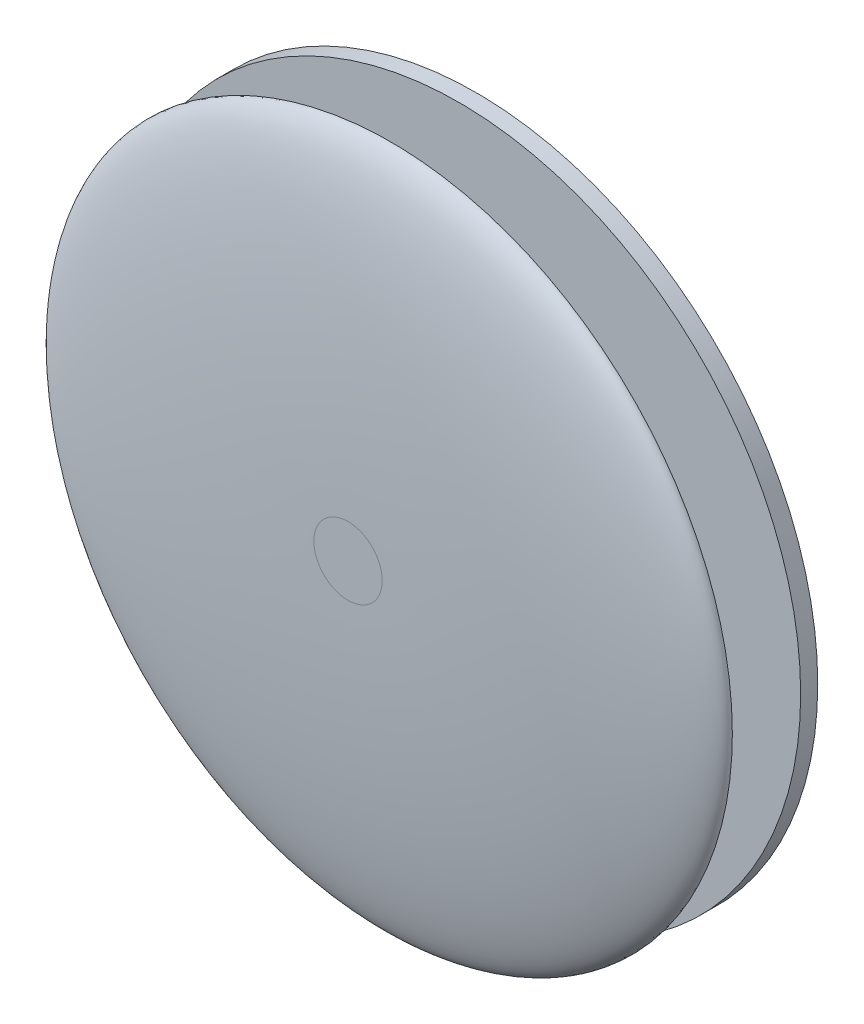
ISO-10303-21;
HEADER;
FILE_DESCRIPTION(('STEP AP214'),'2;1');
FILE_NAME('part.step','',(''),(''),'','','');
FILE_SCHEMA(('AUTOMOTIVE_DESIGN { 1 0 10303 214 1 1 1 1 }'));
ENDSEC;
DATA;
#1=APPLICATION_CONTEXT('core data for automotive mechanical design processes');
#2=APPLICATION_PROTOCOL_DEFINITION('international standard','automotive_design',2000,#1);
#3=PRODUCT_CONTEXT('',#1,'mechanical');
#4=PRODUCT('Part','Part','',(#3));
#5=PRODUCT_RELATED_PRODUCT_CATEGORY('part','',(#4));
#6=PRODUCT_DEFINITION_FORMATION('','',#4);
#7=PRODUCT_DEFINITION_CONTEXT('part definition',#1,'design');
#8=PRODUCT_DEFINITION('design','',#6,#7);
#9=PRODUCT_DEFINITION_SHAPE('','',#8);
#10=(LENGTH_UNIT() NAMED_UNIT(*) SI_UNIT(.MILLI.,.METRE.));
#11=(NAMED_UNIT(*) PLANE_ANGLE_UNIT() SI_UNIT($,.RADIAN.));
#12=(NAMED_UNIT(*) SI_UNIT($,.STERADIAN.) SOLID_ANGLE_UNIT());
#13=UNCERTAINTY_MEASURE_WITH_UNIT(LENGTH_MEASURE(1.E-05),#10,'distance_accuracy_value','');
#14=(GEOMETRIC_REPRESENTATION_CONTEXT(3) GLOBAL_UNCERTAINTY_ASSIGNED_CONTEXT((#13)) GLOBAL_UNIT_ASSIGNED_CONTEXT((#10,
#11,#12)) REPRESENTATION_CONTEXT('',''));
#15=CARTESIAN_POINT('',(0.,0.,0.));
#16=DIRECTION('',(0.,0.,1.));
#17=DIRECTION('',(1.,0.,0.));
#18=AXIS2_PLACEMENT_3D('',#15,#16,#17);
#19=CARTESIAN_POINT('',(0.,0.,4.));
#20=DIRECTION('',(0.,0.,-1.));
#21=DIRECTION('',(-1.,0.,0.));
#22=AXIS2_PLACEMENT_3D('',#19,#20,#21);
#23=CYLINDRICAL_SURFACE('',#22,15.);
#24=CARTESIAN_POINT('',(0.,0.,4.));
#25=DIRECTION('',(0.,0.,1.));
#26=DIRECTION('',(1.,0.,0.));
#27=AXIS2_PLACEMENT_3D('',#24,#25,#26);
#28=CIRCLE('',#27,15.);
#29=CARTESIAN_POINT('',(15.,0.,4.));
#30=VERTEX_POINT('',#29);
#31=EDGE_CURVE('E161',#30,#30,#28,.T.);
#32=ORIENTED_EDGE('',*,*,#31,.F.);
#33=EDGE_LOOP('',(#32));
#34=FACE_BOUND('',#33,.T.);
#35=CARTESIAN_POINT('',(0.,0.,-4.));
#36=DIRECTION('',(0.,0.,1.));
#37=DIRECTION('',(1.,0.,0.));
#38=AXIS2_PLACEMENT_3D('',#35,#36,#37);
#39=CIRCLE('',#38,15.);
#40=CARTESIAN_POINT('',(15.,0.,-4.));
#41=VERTEX_POINT('',#40);
#42=EDGE_CURVE('E155',#41,#41,#39,.T.);
#43=ORIENTED_EDGE('',*,*,#42,.T.);
#44=EDGE_LOOP('',(#43));
#45=FACE_BOUND('',#44,.T.);
#46=CARTESIAN_POINT('',(15.,0.,1.));
#47=CARTESIAN_POINT('',(14.9999995579846,-0.0561035908041249,0.999997534451765));
#48=CARTESIAN_POINT('',(14.9996818744052,-0.112246272047745,0.995262712370675));
#49=CARTESIAN_POINT('',(14.99844511371,-0.222980853460928,0.976442840265436));
#50=CARTESIAN_POINT('',(14.9975253399424,-0.27757088068208,0.962346958699722));
#51=CARTESIAN_POINT('',(14.9951884301052,-0.383580167359696,0.925212124878914));
#52=CARTESIAN_POINT('',(14.9937715598241,-0.435001104032173,0.902177951070831));
#53=CARTESIAN_POINT('',(14.9905997328555,-0.53323346528299,0.84782828282879));
#54=CARTESIAN_POINT('',(14.9888448527116,-0.580045929848533,0.816514662711579));
#55=CARTESIAN_POINT('',(14.9851908975273,-0.667824599458843,0.746437399417309));
#56=CARTESIAN_POINT('',(14.9832916119278,-0.708782006678586,0.707662746156459));
#57=CARTESIAN_POINT('',(14.9795646978327,-0.783612634377517,0.623786928205346));
#58=CARTESIAN_POINT('',(14.9777370723604,-0.817485556226103,0.578685496957766));
#59=CARTESIAN_POINT('',(14.9743579336721,-0.877213460326697,0.483385708670559));
#60=CARTESIAN_POINT('',(14.9728066763058,-0.903061029326378,0.433182695620674));
#61=CARTESIAN_POINT('',(14.970157972686,-0.945957097391599,0.329137425503219));
#62=CARTESIAN_POINT('',(14.9690605209997,-0.963005701794719,0.275295212011386));
#63=CARTESIAN_POINT('',(14.9674452176353,-0.987795199392888,0.165585555390212));
#64=CARTESIAN_POINT('',(14.9669264989871,-0.995550016427559,0.109721271399651));
#65=CARTESIAN_POINT('',(14.9665245630443,-1.00157479750803,-0.00251829772613971));
#66=CARTESIAN_POINT('',(14.9666413377159,-0.999844881457584,-0.0588935763925017));
#67=CARTESIAN_POINT('',(14.9674964150486,-0.986960846772746,-0.170459876015289));
#68=CARTESIAN_POINT('',(14.9682337232656,-0.975821806744588,-0.225652646979321));
#69=CARTESIAN_POINT('',(14.9702452157825,-0.944459115591351,-0.333383290428474));
#70=CARTESIAN_POINT('',(14.9715194036602,-0.924235403922088,-0.38592114521749));
#71=CARTESIAN_POINT('',(14.9744622124897,-0.875260370110762,-0.486898974460401));
#72=CARTESIAN_POINT('',(14.9761311489876,-0.84650222117438,-0.535335628297438));
#73=CARTESIAN_POINT('',(14.9796750723207,-0.78127959292322,-0.626699812511218));
#74=CARTESIAN_POINT('',(14.9815500618019,-0.744815014647449,-0.669627272131067));
#75=CARTESIAN_POINT('',(14.985299217381,-0.665129760832788,-0.748842234727569));
#76=CARTESIAN_POINT('',(14.9871733747298,-0.621896038198311,-0.785116614861973));
#77=CARTESIAN_POINT('',(14.990706156798,-0.529945441656851,-0.849894457053169));
#78=CARTESIAN_POINT('',(14.9923647814319,-0.481228565576779,-0.878397916030164));
#79=CARTESIAN_POINT('',(14.9952797619227,-0.379686494733829,-0.926823748734274));
#80=CARTESIAN_POINT('',(14.9965360937791,-0.326861055090797,-0.946745610514378));
#81=CARTESIAN_POINT('',(14.9985046094346,-0.2186049960803,-0.977433899568392));
#82=CARTESIAN_POINT('',(14.9992168004624,-0.163174411331704,-0.988200448467794));
#83=CARTESIAN_POINT('',(15.0000158534359,-0.0513953711246011,-1.00025619425658));
#84=CARTESIAN_POINT('',(15.0001039123065,0.00495111964684439,-1.00156353158073));
#85=CARTESIAN_POINT('',(14.9996479643198,0.1170625716756,-0.994711163728064));
#86=CARTESIAN_POINT('',(14.9991039612117,0.17282753638049,-0.986551514708553));
#87=CARTESIAN_POINT('',(14.9974458893639,0.282141760529371,-0.961011819645208));
#88=CARTESIAN_POINT('',(14.9963323361678,0.335692976508958,-0.943640111622392));
#89=CARTESIAN_POINT('',(14.9936604087425,0.439120008014194,-0.90017789431421));
#90=CARTESIAN_POINT('',(14.9921020299676,0.488995785972854,-0.874087295927348));
#91=CARTESIAN_POINT('',(14.9887124988692,0.583739131383284,-0.813881840139116));
#92=CARTESIAN_POINT('',(14.9868809368237,0.628598996013498,-0.779754884473148));
#93=CARTESIAN_POINT('',(14.9831524773505,0.711959527646486,-0.704463039096035));
#94=CARTESIAN_POINT('',(14.9812555791934,0.75046012362045,-0.66329807078541));
#95=CARTESIAN_POINT('',(14.9776067587531,0.820070815484494,-0.575020376539933));
#96=CARTESIAN_POINT('',(14.9758550704263,0.851169130356618,-0.527898349782742));
#97=CARTESIAN_POINT('',(14.9726979544392,0.905011874107379,-0.429090824430136));
#98=CARTESIAN_POINT('',(14.971292524406,0.927756360237217,-0.377405357112309));
#99=CARTESIAN_POINT('',(14.9689881146233,0.964225471727894,-0.270980908700749));
#100=CARTESIAN_POINT('',(14.9680887206512,0.977957475914838,-0.216244465484761));
#101=CARTESIAN_POINT('',(14.9668966664299,0.996035908200023,-0.105236668445006));
#102=CARTESIAN_POINT('',(14.9666039991678,1.0003824447804,-0.0489653323699452));
#103=CARTESIAN_POINT('',(14.9666585741728,0.999565483534788,0.0633977896361487));
#104=CARTESIAN_POINT('',(14.9670045703421,0.994420504639091,0.119489711756449));
#105=CARTESIAN_POINT('',(14.9682948425397,0.974804994261808,0.230011267467633));
#106=CARTESIAN_POINT('',(14.9692391196265,0.960334446280208,0.284440898117195));
#107=CARTESIAN_POINT('',(14.9716192360536,0.92248283778284,0.390095294263964));
#108=CARTESIAN_POINT('',(14.9730550683655,0.899101904669178,0.441320105571997));
#109=CARTESIAN_POINT('',(14.9762564813155,0.844095647375272,0.539119741918501));
#110=CARTESIAN_POINT('',(14.9780220540122,0.812470521740288,0.585694678902752));
#111=CARTESIAN_POINT('',(14.9816880295888,0.74180477494363,0.672966638999559));
#112=CARTESIAN_POINT('',(14.9835886735546,0.702750674582999,0.713652737331899));
#113=CARTESIAN_POINT('',(14.9873085213532,0.618355426554709,0.787906009267211));
#114=CARTESIAN_POINT('',(14.9891277051874,0.573012746113305,0.821471442223763));
#115=CARTESIAN_POINT('',(14.9924817745562,0.477269598838893,0.880558817545837));
#116=CARTESIAN_POINT('',(14.994016274223,0.426862407970513,0.906069875193851));
#117=CARTESIAN_POINT('',(14.9966230436255,0.322506215419355,0.948235029231639));
#118=CARTESIAN_POINT('',(14.9976958526619,0.268561431383448,0.964899464703577));
#119=CARTESIAN_POINT('',(14.9989782377769,0.178573873772114,0.984582489588203));
#120=CARTESIAN_POINT('',(14.9993596884566,0.143112284161978,0.990356543317503));
#121=CARTESIAN_POINT('',(14.9998707107647,0.0717724628196567,0.998066084172604));
#122=CARTESIAN_POINT('',(15.0000002827948,0.0358942317520725,1.0000015774206));
#123=CARTESIAN_POINT('',(15.,0.,1.));
#124=B_SPLINE_CURVE_WITH_KNOTS('',3,(#46,#47,#48,#49,#50,#51,#52,#53,#54,#55,#56,#57,#58,#59,
#60,#61,#62,#63,#64,#65,#66,#67,#68,#69,#70,#71,#72,#73,#74,#75,#76,#77,#78,#79,#80,#81,#82,#83,
#84,#85,#86,#87,#88,#89,#90,#91,#92,#93,#94,#95,#96,#97,#98,#99,#100,#101,#102,#103,#104,#105,
#106,#107,#108,#109,#110,#111,#112,#113,#114,#115,#116,#117,#118,#119,#120,#121,#122,#123),
.UNSPECIFIED.,.T.,.F.,(4,2,2,2,2,2,2,2,2,2,2,2,2,2,2,2,2,2,2,2,2,2,2,2,2,2,2,2,2,2,2,2,2,2,2,2,
2,2,4),(0.,0.168179734044292,0.336554406184462,0.504839188283248,0.673085906323963,
0.841582833287236,1.01008686142994,1.17874608173166,1.34740328286781,1.51580748668391,
1.68420956157893,1.85234227434813,2.02047610764315,2.18874479730908,2.35701564790423,
2.52561491574574,2.69421425040695,2.86282364170141,3.03143079303741,3.19971451152963,
3.36799723178317,3.53612789526984,3.70426027699717,3.87264740882399,4.04103642129616,
4.20969166582445,4.37834575448806,4.54686158747343,4.71537547265433,4.88356091745659,
5.05174665983533,5.21992999755776,5.3881092852874,5.55659668097782,5.72512521606818,
5.89388053603615,6.06243819437153,6.17003722486686,6.27763608375031),.UNSPECIFIED.);
#125=CARTESIAN_POINT('',(15.,0.,1.));
#126=VERTEX_POINT('',#125);
#127=EDGE_CURVE('E128',#126,#126,#124,.T.);
#128=ORIENTED_EDGE('',*,*,#127,.F.);
#129=EDGE_LOOP('',(#128));
#130=FACE_BOUND('',#129,.T.);
#131=ADVANCED_FACE('F49',(#34,#45,#130),#23,.T.);
#132=CARTESIAN_POINT('',(0.,0.,4.));
#133=DIRECTION('',(0.,0.,-1.));
#134=DIRECTION('',(-1.,0.,0.));
#135=AXIS2_PLACEMENT_3D('',#132,#133,#134);
#136=CYLINDRICAL_SURFACE('',#135,2.5);
#137=CARTESIAN_POINT('',(0.,0.,-6.));
#138=DIRECTION('',(0.,0.,1.));
#139=DIRECTION('',(1.,0.,0.));
#140=AXIS2_PLACEMENT_3D('',#137,#138,#139);
#141=CIRCLE('',#140,2.5);
#142=CARTESIAN_POINT('',(2.5,0.,-6.));
#143=VERTEX_POINT('',#142);
#144=EDGE_CURVE('E156',#143,#143,#141,.T.);
#145=ORIENTED_EDGE('',*,*,#144,.F.);
#146=EDGE_LOOP('',(#145));
#147=FACE_BOUND('',#146,.T.);
#148=CARTESIAN_POINT('',(0.,0.,4.));
#149=DIRECTION('',(0.,0.,1.));
#150=DIRECTION('',(1.,0.,0.));
#151=AXIS2_PLACEMENT_3D('',#148,#149,#150);
#152=CIRCLE('',#151,2.5);
#153=CARTESIAN_POINT('',(2.5,0.,4.));
#154=VERTEX_POINT('',#153);
#155=EDGE_CURVE('E152',#154,#154,#152,.T.);
#156=ORIENTED_EDGE('',*,*,#155,.T.);
#157=EDGE_LOOP('',(#156));
#158=FACE_BOUND('',#157,.T.);
#159=CARTESIAN_POINT('',(2.5,0.,1.));
#160=CARTESIAN_POINT('',(2.49999635613542,-0.0537465027214456,0.999995074088137));
#161=CARTESIAN_POINT('',(2.49824647153466,-0.107586282045337,0.995641123955812));
#162=CARTESIAN_POINT('',(2.49141726550321,-0.213748240208948,0.978376148239382));
#163=CARTESIAN_POINT('',(2.48632889349439,-0.266065888780624,0.965441860456933));
#164=CARTESIAN_POINT('',(2.47337104606559,-0.367476961363701,0.931561960970584));
#165=CARTESIAN_POINT('',(2.46551068182036,-0.416580330808479,0.910642576891635));
#166=CARTESIAN_POINT('',(2.44778305398039,-0.510535985164184,0.861490413336727));
#167=CARTESIAN_POINT('',(2.43791648729028,-0.555389738375496,0.833260172540535));
#168=CARTESIAN_POINT('',(2.41665443085209,-0.641750503785197,0.768882250719531));
#169=CARTESIAN_POINT('',(2.40521148464595,-0.683031136275106,0.732446671879868));
#170=CARTESIAN_POINT('',(2.38230288453097,-0.759087502392361,0.653299998261611));
#171=CARTESIAN_POINT('',(2.37083722226896,-0.793860053566766,0.610585851394129));
#172=CARTESIAN_POINT('',(2.34861395898568,-0.857437283646439,0.517785964878866));
#173=CARTESIAN_POINT('',(2.33791057982476,-0.885907490597736,0.467456756988401));
#174=CARTESIAN_POINT('',(2.31916823593396,-0.933877359518574,0.362231800789979));
#175=CARTESIAN_POINT('',(2.31112800622088,-0.953381282142917,0.30733823607582));
#176=CARTESIAN_POINT('',(2.29913178830409,-0.981949411697934,0.197143833203949));
#177=CARTESIAN_POINT('',(2.29500710177802,-0.991446982902824,0.141974382211893));
#178=CARTESIAN_POINT('',(2.29082002024572,-1.00108648082001,0.0306825008463662));
#179=CARTESIAN_POINT('',(2.29075562761384,-1.00123300815661,-0.0254394473125075));
#180=CARTESIAN_POINT('',(2.29455250139997,-0.992494683752272,-0.132878335729022));
#181=CARTESIAN_POINT('',(2.29814087519225,-0.984237657152568,-0.184257857204516));
#182=CARTESIAN_POINT('',(2.30838093803918,-0.95997344014891,-0.284829778003357));
#183=CARTESIAN_POINT('',(2.31503316160836,-0.943964897402315,-0.334021794055154));
#184=CARTESIAN_POINT('',(2.33079742544265,-0.904347366275536,-0.430008918098021));
#185=CARTESIAN_POINT('',(2.33995689640394,-0.880589931157658,-0.476734619527345));
#186=CARTESIAN_POINT('',(2.35969058194945,-0.826253230366107,-0.565707908180782));
#187=CARTESIAN_POINT('',(2.37026532728424,-0.795671402550422,-0.607953804701403));
#188=CARTESIAN_POINT('',(2.39263368371135,-0.725775299727216,-0.690204864400999));
#189=CARTESIAN_POINT('',(2.40445832488076,-0.685968731485317,-0.729784364723008));
#190=CARTESIAN_POINT('',(2.42729912479141,-0.600157213715096,-0.80184223900102));
#191=CARTESIAN_POINT('',(2.43831512222662,-0.554151032667216,-0.834319198705147));
#192=CARTESIAN_POINT('',(2.45857340632274,-0.456038826302921,-0.891808723707917));
#193=CARTESIAN_POINT('',(2.46777635047707,-0.403830245673238,-0.916661140598527));
#194=CARTESIAN_POINT('',(2.48307414164379,-0.295511882741441,-0.957083930539028));
#195=CARTESIAN_POINT('',(2.48917056731191,-0.239404098424836,-0.972659018778705));
#196=CARTESIAN_POINT('',(2.49728069753455,-0.12844794380391,-0.993224147709852));
#197=CARTESIAN_POINT('',(2.49951472916757,-0.0737216469927669,-0.99878622712678));
#198=CARTESIAN_POINT('',(2.50034239255315,0.0359226549039089,-1.00085655026431));
#199=CARTESIAN_POINT('',(2.49893696791146,0.0908406066119622,-0.997367140773755));
#200=CARTESIAN_POINT('',(2.49278783531876,0.196716369560994,-0.981854123724004));
#201=CARTESIAN_POINT('',(2.48819695672762,0.247741245887738,-0.970221009824512));
#202=CARTESIAN_POINT('',(2.4762972070275,0.34706771403039,-0.939282145845093));
#203=CARTESIAN_POINT('',(2.46898798678265,0.395368955112423,-0.919975410165659));
#204=CARTESIAN_POINT('',(2.45208297385406,0.489539392908351,-0.873607530160025));
#205=CARTESIAN_POINT('',(2.44242407989902,0.535289011377703,-0.846327263978427));
#206=CARTESIAN_POINT('',(2.42186682372762,0.621721795623278,-0.785029838047178));
#207=CARTESIAN_POINT('',(2.41096796555135,0.662402920380563,-0.751009978538692));
#208=CARTESIAN_POINT('',(2.38822558819056,0.74036152151441,-0.674564993525186));
#209=CARTESIAN_POINT('',(2.37636720712526,0.777236966903033,-0.631733229246896));
#210=CARTESIAN_POINT('',(2.35370836458566,0.843375598706856,-0.540279958495316));
#211=CARTESIAN_POINT('',(2.34290807763255,0.872637530668755,-0.491657499830025));
#212=CARTESIAN_POINT('',(2.32357149953854,0.922903750965814,-0.389269152702947));
#213=CARTESIAN_POINT('',(2.31505815442394,0.943825297267227,-0.335458000393844));
#214=CARTESIAN_POINT('',(2.30161836738966,0.976148109852652,-0.224633174142421));
#215=CARTESIAN_POINT('',(2.29668927847999,0.987556402634658,-0.167621897093786));
#216=CARTESIAN_POINT('',(2.29135879649963,0.999857808639201,-0.0564360491127281));
#217=CARTESIAN_POINT('',(2.29065710504086,1.00144854115143,-0.0023525802033241));
#218=CARTESIAN_POINT('',(2.29307418016549,0.995901579638762,0.105272428856647));
#219=CARTESIAN_POINT('',(2.29619246162397,0.988764993956891,0.158814036951292));
#220=CARTESIAN_POINT('',(2.3056332453951,0.966535683076824,0.261666094927521));
#221=CARTESIAN_POINT('',(2.31182415913725,0.951768746785489,0.3110601372165));
#222=CARTESIAN_POINT('',(2.32662000616348,0.915002724245506,0.406689314806741));
#223=CARTESIAN_POINT('',(2.33522560603003,0.893001640696906,0.452923573449913));
#224=CARTESIAN_POINT('',(2.35449304802246,0.840936381379865,0.543804809635389));
#225=CARTESIAN_POINT('',(2.36524441156621,0.810482667579745,0.588209335065242));
#226=CARTESIAN_POINT('',(2.38731902186119,0.742946059635748,0.671496658601878));
#227=CARTESIAN_POINT('',(2.39864244024203,0.70586116740906,0.710377786064158));
#228=CARTESIAN_POINT('',(2.42146783543697,0.623252753136231,0.784101426631808));
#229=CARTESIAN_POINT('',(2.43293378981093,0.577338000573069,0.818518653449034));
#230=CARTESIAN_POINT('',(2.45400203356858,0.479950160142889,0.879168521310818));
#231=CARTESIAN_POINT('',(2.46360345546453,0.428474502273618,0.905397356076264));
#232=CARTESIAN_POINT('',(2.47969857407931,0.322369031247601,0.948311107595145));
#233=CARTESIAN_POINT('',(2.48624681527514,0.267815809109848,0.965164661780169));
#234=CARTESIAN_POINT('',(2.49572153104683,0.15643827314061,0.989319560477133));
#235=CARTESIAN_POINT('',(2.49865949747819,0.0996217629294559,0.99665121837195));
#236=CARTESIAN_POINT('',(2.49987949752068,0.0284561489454644,0.999697690489137));
#237=CARTESIAN_POINT('',(2.50000096484588,0.014231344370379,1.0000013043146));
#238=CARTESIAN_POINT('',(2.5,0.,1.));
#239=B_SPLINE_CURVE_WITH_KNOTS('',3,(#159,#160,#161,#162,#163,#164,#165,#166,#167,#168,#169,
#170,#171,#172,#173,#174,#175,#176,#177,#178,#179,#180,#181,#182,#183,#184,#185,#186,#187,#188,
#189,#190,#191,#192,#193,#194,#195,#196,#197,#198,#199,#200,#201,#202,#203,#204,#205,#206,#207,
#208,#209,#210,#211,#212,#213,#214,#215,#216,#217,#218,#219,#220,#221,#222,#223,#224,#225,#226,
#227,#228,#229,#230,#231,#232,#233,#234,#235,#236,#237,#238),.UNSPECIFIED.,.T.,.F.,(4,2,2,2,2,2,
2,2,2,2,2,2,2,2,2,2,2,2,2,2,2,2,2,2,2,2,2,2,2,2,2,2,2,2,2,2,2,2,2,4),(0.,0.161201493946536,
0.322841818003967,0.483955728735791,0.645013767839921,0.812986908501986,0.981041974672057,
1.15657629409608,1.33202711559134,1.49952052654414,1.66693153170244,1.82269164200686,
1.97847893628024,2.13744563149408,2.29647210969092,2.46779174593278,2.63914546419866,
2.81388456581403,2.98853478056895,3.15284592264004,3.31711446785041,3.47400227782183,
3.63091024496898,3.79261756699131,3.95438979749484,4.12684237312207,4.29932334521874,
4.47347522570414,4.64749836322967,4.80899836696374,4.97047786281523,5.12557159274385,
5.28070817902581,5.44472734028346,5.60879600674197,5.78350211766918,5.95828931820266,
6.12982150506659,6.30080626202171,6.34349022948398),.UNSPECIFIED.);
#240=CARTESIAN_POINT('',(2.5,0.,1.));
#241=VERTEX_POINT('',#240);
#242=EDGE_CURVE('E57',#241,#241,#239,.T.);
#243=ORIENTED_EDGE('',*,*,#242,.T.);
#244=EDGE_LOOP('',(#243));
#245=FACE_BOUND('',#244,.T.);
#246=ADVANCED_FACE('F99',(#147,#158,#245),#136,.F.);
#247=CARTESIAN_POINT('',(0.,0.,9.));
#248=DIRECTION('',(0.,0.,1.));
#249=DIRECTION('',(1.,0.,0.));
#250=AXIS2_PLACEMENT_3D('',#247,#248,#249);
#251=PLANE('',#250);
#252=CARTESIAN_POINT('',(4.,0.,9.));
#253=CARTESIAN_POINT('',(4.,-0.523598770144721,9.));
#254=CARTESIAN_POINT('',(3.89589070458609,-1.04699154247611,9.));
#255=CARTESIAN_POINT('',(3.49514555550419,-2.01447591644461,9.));
#256=CARTESIAN_POINT('',(3.19866736573605,-2.45818688375644,9.));
#257=CARTESIAN_POINT('',(2.45818688375631,-3.19866736573595,9.));
#258=CARTESIAN_POINT('',(2.01447591644466,-3.49514555550419,9.));
#259=CARTESIAN_POINT('',(1.04699154247604,-3.8958907045861,9.));
#260=CARTESIAN_POINT('',(0.523598770144151,-4.,9.));
#261=CARTESIAN_POINT('',(-0.523598770144139,-4.,9.));
#262=CARTESIAN_POINT('',(-1.04699154247611,-3.89589070458598,9.));
#263=CARTESIAN_POINT('',(-2.01447591644461,-3.4951455555043,9.));
#264=CARTESIAN_POINT('',(-2.45818688375634,-3.19866736573604,9.));
#265=CARTESIAN_POINT('',(-3.19866736573603,-2.45818688375634,9.));
#266=CARTESIAN_POINT('',(-3.49514555550418,-2.01447591644461,9.));
#267=CARTESIAN_POINT('',(-3.89589070458611,-1.04699154247609,9.));
#268=CARTESIAN_POINT('',(-4.,-0.523598770144144,9.));
#269=CARTESIAN_POINT('',(-4.,0.523598770144145,9.));
#270=CARTESIAN_POINT('',(-3.89589070458611,1.04699154247605,9.));
#271=CARTESIAN_POINT('',(-3.49514555550417,2.01447591644468,9.));
#272=CARTESIAN_POINT('',(-3.19866736573592,2.45818688375634,9.));
#273=CARTESIAN_POINT('',(-2.45818688375646,3.19866736573603,9.));
#274=CARTESIAN_POINT('',(-2.01447591644464,3.49514555550424,9.));
#275=CARTESIAN_POINT('',(-1.04699154247607,3.89589070458605,9.));
#276=CARTESIAN_POINT('',(-0.523598770144144,4.,9.));
#277=CARTESIAN_POINT('',(0.523598770144145,4.,9.));
#278=CARTESIAN_POINT('',(1.04699154247613,3.89589070458605,9.));
#279=CARTESIAN_POINT('',(2.01447591644458,3.49514555550424,9.));
#280=CARTESIAN_POINT('',(2.45818688375639,3.1986673657361,9.));
#281=CARTESIAN_POINT('',(3.19866736573599,2.45818688375628,9.));
#282=CARTESIAN_POINT('',(3.49514555550426,2.01447591644457,9.));
#283=CARTESIAN_POINT('',(3.89589070458602,1.04699154247614,9.));
#284=CARTESIAN_POINT('',(4.,0.523598770144721,9.));
#285=CARTESIAN_POINT('',(4.,0.,9.));
#286=(BOUNDED_CURVE() B_SPLINE_CURVE(3,(#252,#253,#254,#255,#256,#257,#258,#259,#260,#261,#262,
#263,#264,#265,#266,#267,#268,#269,#270,#271,#272,#273,#274,#275,#276,#277,#278,#279,#280,#281,
#282,#283,#284,#285),.UNSPECIFIED.,.T.,.F.) B_SPLINE_CURVE_WITH_KNOTS((4,2,2,2,2,2,2,2,2,2,2,2,
2,2,2,2,4),(0.,0.392699081698725,0.785398163397448,1.17809724509617,1.5707963267949,
1.96349540849362,2.35619449019234,2.74889357189107,3.14159265358979,3.53429173528852,
3.92699081698724,4.31968989868597,4.71238898038469,5.10508806208341,5.49778714378214,
5.89048622548086,6.28318530717959),
.UNSPECIFIED.) CURVE() GEOMETRIC_REPRESENTATION_ITEM() RATIONAL_B_SPLINE_CURVE((1.,1.,1.,1.,1.,
1.,1.,1.,1.,1.,1.,1.,1.,1.,1.,1.,1.,1.,1.,1.,1.,1.,1.,1.,1.,1.,1.,1.,1.,1.,1.,1.,1.,1.)) REPRESENTATION_ITEM(''));
#287=CARTESIAN_POINT('',(4.,0.,9.));
#288=VERTEX_POINT('',#287);
#289=EDGE_CURVE('E12',#288,#288,#286,.F.);
#290=ORIENTED_EDGE('',*,*,#289,.T.);
#291=EDGE_LOOP('',(#290));
#292=FACE_BOUND('',#291,.T.);
#293=ADVANCED_FACE('F88',(#292),#251,.T.);
#294=CARTESIAN_POINT('',(0.,0.,4.));
#295=DIRECTION('',(0.,0.,1.));
#296=DIRECTION('',(1.,0.,0.));
#297=AXIS2_PLACEMENT_3D('',#294,#295,#296);
#298=PLANE('',#297);
#299=CARTESIAN_POINT('',(40.,0.,4.));
#300=CARTESIAN_POINT('',(40.,5.23598770144721,4.));
#301=CARTESIAN_POINT('',(38.95890704586,10.4699154247622,4.));
#302=CARTESIAN_POINT('',(34.9514555550429,20.144759164445,4.));
#303=CARTESIAN_POINT('',(31.9866736573599,24.5818688375639,4.));
#304=CARTESIAN_POINT('',(24.5818688375639,31.9866736573599,4.));
#305=CARTESIAN_POINT('',(20.1447591644458,34.9514555550426,4.));
#306=CARTESIAN_POINT('',(10.4699154247614,38.9589070458603,4.));
#307=CARTESIAN_POINT('',(5.23598770144145,40.,4.));
#308=CARTESIAN_POINT('',(-5.23598770144145,40.,4.));
#309=CARTESIAN_POINT('',(-10.4699154247616,38.9589070458602,4.));
#310=CARTESIAN_POINT('',(-20.1447591644456,34.9514555550427,4.));
#311=CARTESIAN_POINT('',(-24.5818688375641,31.9866736573597,4.));
#312=CARTESIAN_POINT('',(-31.9866736573597,24.5818688375641,4.));
#313=CARTESIAN_POINT('',(-34.9514555550417,20.1447591644478,4.));
#314=CARTESIAN_POINT('',(-38.9589070458611,10.4699154247595,4.));
#315=CARTESIAN_POINT('',(-40.,5.23598770144145,4.));
#316=CARTESIAN_POINT('',(-40.,-5.23598770144144,4.));
#317=CARTESIAN_POINT('',(-38.958907045861,-10.4699154247596,4.));
#318=CARTESIAN_POINT('',(-34.9514555550419,-20.1447591644475,4.));
#319=CARTESIAN_POINT('',(-31.9866736573606,-24.5818688375632,4.));
#320=CARTESIAN_POINT('',(-24.5818688375632,-31.9866736573606,4.));
#321=CARTESIAN_POINT('',(-20.1447591644466,-34.9514555550423,4.));
#322=CARTESIAN_POINT('',(-10.4699154247607,-38.9589070458606,4.));
#323=CARTESIAN_POINT('',(-5.23598770144139,-40.,4.));
#324=CARTESIAN_POINT('',(5.23598770144152,-40.,4.));
#325=CARTESIAN_POINT('',(10.4699154247593,-38.9589070458612,4.));
#326=CARTESIAN_POINT('',(20.1447591644478,-34.9514555550418,4.));
#327=CARTESIAN_POINT('',(24.5818688375638,-31.98667365736,4.));
#328=CARTESIAN_POINT('',(31.9866736573599,-24.5818688375639,4.));
#329=CARTESIAN_POINT('',(34.9514555550423,-20.1447591644465,4.));
#330=CARTESIAN_POINT('',(38.9589070458605,-10.4699154247608,4.));
#331=CARTESIAN_POINT('',(40.,-5.23598770144722,4.));
#332=CARTESIAN_POINT('',(40.,0.,4.));
#333=(BOUNDED_CURVE() B_SPLINE_CURVE(3,(#299,#300,#301,#302,#303,#304,#305,#306,#307,#308,#309,
#310,#311,#312,#313,#314,#315,#316,#317,#318,#319,#320,#321,#322,#323,#324,#325,#326,#327,#328,
#329,#330,#331,#332),.UNSPECIFIED.,.T.,.F.) B_SPLINE_CURVE_WITH_KNOTS((4,2,2,2,2,2,2,2,2,2,2,2,
2,2,2,2,4),(0.,0.392699081698724,0.785398163397448,1.17809724509617,1.5707963267949,
1.96349540849362,2.35619449019234,2.74889357189107,3.14159265358979,3.53429173528852,
3.92699081698724,4.31968989868597,4.71238898038469,5.10508806208341,5.49778714378214,
5.89048622548086,6.28318530717959),
.UNSPECIFIED.) CURVE() GEOMETRIC_REPRESENTATION_ITEM() RATIONAL_B_SPLINE_CURVE((1.,1.,1.,1.,1.,
1.,1.,1.,1.,1.,1.,1.,1.,1.,1.,1.,1.,1.,1.,1.,1.,1.,1.,1.,1.,1.,1.,1.,1.,1.,1.,1.,1.,1.)) REPRESENTATION_ITEM(''));
#334=CARTESIAN_POINT('',(40.,0.,4.));
#335=VERTEX_POINT('',#334);
#336=EDGE_CURVE('E73',#335,#335,#333,.T.);
#337=ORIENTED_EDGE('',*,*,#336,.F.);
#338=EDGE_LOOP('',(#337));
#339=FACE_BOUND('',#338,.T.);
#340=ORIENTED_EDGE('',*,*,#31,.T.);
#341=EDGE_LOOP('',(#340));
#342=FACE_BOUND('',#341,.T.);
#343=ADVANCED_FACE('F98',(#339,#342),#298,.F.);
#344=CARTESIAN_POINT('',(0.,0.,-4.));
#345=DIRECTION('',(0.,0.,1.));
#346=DIRECTION('',(1.,0.,0.));
#347=AXIS2_PLACEMENT_3D('',#344,#345,#346);
#348=PLANE('',#347);
#349=CARTESIAN_POINT('',(16.5,0.,-4.));
#350=DIRECTION('',(0.,0.,1.));
#351=DIRECTION('',(1.,0.,0.));
#352=AXIS2_PLACEMENT_3D('',#349,#350,#351);
#353=CIRCLE('',#352,1.);
#354=CARTESIAN_POINT('',(17.5,0.,-4.));
#355=VERTEX_POINT('',#354);
#356=EDGE_CURVE('E163',#355,#355,#353,.T.);
#357=ORIENTED_EDGE('',*,*,#356,.F.);
#358=EDGE_LOOP('',(#357));
#359=FACE_BOUND('',#358,.T.);
#360=CARTESIAN_POINT('',(0.,0.,-4.));
#361=DIRECTION('',(0.,0.,1.));
#362=DIRECTION('',(1.,0.,0.));
#363=AXIS2_PLACEMENT_3D('',#360,#361,#362);
#364=CIRCLE('',#363,40.);
#365=CARTESIAN_POINT('',(40.,0.,-4.));
#366=VERTEX_POINT('',#365);
#367=EDGE_CURVE('E79',#366,#366,#364,.T.);
#368=ORIENTED_EDGE('',*,*,#367,.T.);
#369=EDGE_LOOP('',(#368));
#370=FACE_BOUND('',#369,.T.);
#371=ORIENTED_EDGE('',*,*,#42,.F.);
#372=EDGE_LOOP('',(#371));
#373=FACE_BOUND('',#372,.T.);
#374=ADVANCED_FACE('F100',(#359,#370,#373),#348,.T.);
#375=CARTESIAN_POINT('',(0.,0.,-6.));
#376=DIRECTION('',(0.,0.,1.));
#377=DIRECTION('',(1.,0.,0.));
#378=AXIS2_PLACEMENT_3D('',#375,#376,#377);
#379=PLANE('',#378);
#380=CARTESIAN_POINT('',(16.5,0.,-6.));
#381=DIRECTION('',(0.,0.,-1.));
#382=DIRECTION('',(-1.,0.,0.));
#383=AXIS2_PLACEMENT_3D('',#380,#381,#382);
#384=CIRCLE('',#383,1.);
#385=CARTESIAN_POINT('',(15.5,0.,-6.));
#386=VERTEX_POINT('',#385);
#387=EDGE_CURVE('E135',#386,#386,#384,.T.);
#388=ORIENTED_EDGE('',*,*,#387,.F.);
#389=EDGE_LOOP('',(#388));
#390=FACE_BOUND('',#389,.T.);
#391=ORIENTED_EDGE('',*,*,#144,.T.);
#392=EDGE_LOOP('',(#391));
#393=FACE_BOUND('',#392,.T.);
#394=CARTESIAN_POINT('',(0.,0.,-6.));
#395=DIRECTION('',(0.,0.,1.));
#396=DIRECTION('',(1.,0.,0.));
#397=AXIS2_PLACEMENT_3D('',#394,#395,#396);
#398=CIRCLE('',#397,40.);
#399=CARTESIAN_POINT('',(40.,0.,-6.));
#400=VERTEX_POINT('',#399);
#401=EDGE_CURVE('E67',#400,#400,#398,.T.);
#402=ORIENTED_EDGE('',*,*,#401,.F.);
#403=EDGE_LOOP('',(#402));
#404=FACE_BOUND('',#403,.T.);
#405=ADVANCED_FACE('F102',(#390,#393,#404),#379,.F.);
#406=CARTESIAN_POINT('',(0.,0.,9.));
#407=DIRECTION('',(0.,0.,-1.));
#408=DIRECTION('',(-1.,0.,0.));
#409=AXIS2_PLACEMENT_3D('',#406,#407,#408);
#410=CYLINDRICAL_SURFACE('',#409,40.);
#411=ORIENTED_EDGE('',*,*,#401,.T.);
#412=EDGE_LOOP('',(#411));
#413=FACE_BOUND('',#412,.T.);
#414=ORIENTED_EDGE('',*,*,#367,.F.);
#415=EDGE_LOOP('',(#414));
#416=FACE_BOUND('',#415,.T.);
#417=ADVANCED_FACE('F104',(#413,#416),#410,.T.);
#418=CARTESIAN_POINT('',(4.,0.,9.));
#419=CARTESIAN_POINT('',(4.,0.523598770144721,9.));
#420=CARTESIAN_POINT('',(3.89589070458602,1.04699154247614,9.));
#421=CARTESIAN_POINT('',(3.49514555550426,2.01447591644457,9.));
#422=CARTESIAN_POINT('',(3.19866736573599,2.45818688375628,9.));
#423=CARTESIAN_POINT('',(2.45818688375639,3.1986673657361,9.));
#424=CARTESIAN_POINT('',(2.01447591644458,3.49514555550424,9.));
#425=CARTESIAN_POINT('',(1.04699154247613,3.89589070458605,9.));
#426=CARTESIAN_POINT('',(0.523598770144145,4.,9.));
#427=CARTESIAN_POINT('',(-0.523598770144144,4.,9.));
#428=CARTESIAN_POINT('',(-1.04699154247607,3.89589070458605,9.));
#429=CARTESIAN_POINT('',(-2.01447591644464,3.49514555550424,9.));
#430=CARTESIAN_POINT('',(-2.45818688375646,3.19866736573603,9.));
#431=CARTESIAN_POINT('',(-3.19866736573592,2.45818688375634,9.));
#432=CARTESIAN_POINT('',(-3.49514555550417,2.01447591644468,9.));
#433=CARTESIAN_POINT('',(-3.89589070458611,1.04699154247605,9.));
#434=CARTESIAN_POINT('',(-4.,0.523598770144145,9.));
#435=CARTESIAN_POINT('',(-4.,-0.523598770144144,9.));
#436=CARTESIAN_POINT('',(-3.89589070458611,-1.04699154247609,9.));
#437=CARTESIAN_POINT('',(-3.49514555550418,-2.01447591644461,9.));
#438=CARTESIAN_POINT('',(-3.19866736573603,-2.45818688375634,9.));
#439=CARTESIAN_POINT('',(-2.45818688375634,-3.19866736573604,9.));
#440=CARTESIAN_POINT('',(-2.01447591644461,-3.4951455555043,9.));
#441=CARTESIAN_POINT('',(-1.04699154247611,-3.89589070458598,9.));
#442=CARTESIAN_POINT('',(-0.523598770144139,-4.,9.));
#443=CARTESIAN_POINT('',(0.523598770144151,-4.,9.));
#444=CARTESIAN_POINT('',(1.04699154247604,-3.8958907045861,9.));
#445=CARTESIAN_POINT('',(2.01447591644466,-3.49514555550419,9.));
#446=CARTESIAN_POINT('',(2.45818688375631,-3.19866736573595,9.));
#447=CARTESIAN_POINT('',(3.19866736573605,-2.45818688375644,9.));
#448=CARTESIAN_POINT('',(3.49514555550419,-2.01447591644461,9.));
#449=CARTESIAN_POINT('',(3.89589070458609,-1.04699154247611,9.));
#450=CARTESIAN_POINT('',(4.,-0.523598770144721,9.));
#451=CARTESIAN_POINT('',(4.,0.,9.));
#452=CARTESIAN_POINT('',(40.,0.,9.));
#453=CARTESIAN_POINT('',(40.,5.23598770144721,9.00000000000091));
#454=CARTESIAN_POINT('',(38.9589070458598,10.4699154247626,9.));
#455=CARTESIAN_POINT('',(34.9514555550431,20.1447591644446,9.));
#456=CARTESIAN_POINT('',(31.9866736573626,24.5818688375666,8.99999999999909));
#457=CARTESIAN_POINT('',(24.5818688375612,31.9866736573571,9.00000000000091));
#458=CARTESIAN_POINT('',(20.1447591644452,34.9514555550404,8.99999999999909));
#459=CARTESIAN_POINT('',(10.469915424762,38.9589070458625,9.00000000000091));
#460=CARTESIAN_POINT('',(5.23598770144145,40.,9.));
#461=CARTESIAN_POINT('',(-5.23598770144145,40.,9.));
#462=CARTESIAN_POINT('',(-10.4699154247616,38.9589070458589,8.99999999999909));
#463=CARTESIAN_POINT('',(-20.1447591644456,34.951455555044,9.00000000000091));
#464=CARTESIAN_POINT('',(-24.5818688375623,31.9866736573579,8.99999999999909));
#465=CARTESIAN_POINT('',(-31.9866736573615,24.5818688375659,9.00000000000091));
#466=CARTESIAN_POINT('',(-34.9514555550404,20.1447591644473,8.99999999999909));
#467=CARTESIAN_POINT('',(-38.9589070458625,10.46991542476,9.00000000000091));
#468=CARTESIAN_POINT('',(-40.,5.23598770144146,9.));
#469=CARTESIAN_POINT('',(-40.,-5.23598770144145,9.));
#470=CARTESIAN_POINT('',(-38.9589070458625,-10.4699154247604,8.99999999999864));
#471=CARTESIAN_POINT('',(-34.9514555550404,-20.1447591644467,9.00000000000136));
#472=CARTESIAN_POINT('',(-31.9866736573615,-24.581868837565,8.99999999999909));
#473=CARTESIAN_POINT('',(-24.5818688375623,-31.9866736573588,9.0000000000009));
#474=CARTESIAN_POINT('',(-20.1447591644473,-34.951455555044,9.));
#475=CARTESIAN_POINT('',(-10.46991542476,-38.9589070458589,9.));
#476=CARTESIAN_POINT('',(-5.23598770144139,-39.9999999999982,8.99999999999955));
#477=CARTESIAN_POINT('',(5.23598770144152,-40.0000000000018,9.00000000000045));
#478=CARTESIAN_POINT('',(10.4699154247599,-38.9589070458626,8.99999999999909));
#479=CARTESIAN_POINT('',(20.1447591644472,-34.9514555550404,9.00000000000091));
#480=CARTESIAN_POINT('',(24.5818688375642,-31.9866736573595,9.));
#481=CARTESIAN_POINT('',(31.9866736573594,-24.5818688375644,9.));
#482=CARTESIAN_POINT('',(34.9514555550421,-20.1447591644464,8.99999999999909));
#483=CARTESIAN_POINT('',(38.9589070458607,-10.4699154247609,9.00000000000091));
#484=CARTESIAN_POINT('',(40.,-5.23598770144722,8.99999999999909));
#485=CARTESIAN_POINT('',(40.,0.,9.));
#486=CARTESIAN_POINT('',(40.,0.,4.));
#487=CARTESIAN_POINT('',(40.,5.23598770144721,4.));
#488=CARTESIAN_POINT('',(38.95890704586,10.4699154247622,4.));
#489=CARTESIAN_POINT('',(34.9514555550429,20.144759164445,4.));
#490=CARTESIAN_POINT('',(31.9866736573599,24.5818688375639,4.));
#491=CARTESIAN_POINT('',(24.5818688375639,31.9866736573599,4.));
#492=CARTESIAN_POINT('',(20.1447591644458,34.9514555550426,4.));
#493=CARTESIAN_POINT('',(10.4699154247614,38.9589070458603,4.));
#494=CARTESIAN_POINT('',(5.23598770144145,40.,4.));
#495=CARTESIAN_POINT('',(-5.23598770144145,40.,4.));
#496=CARTESIAN_POINT('',(-10.4699154247616,38.9589070458602,4.));
#497=CARTESIAN_POINT('',(-20.1447591644456,34.9514555550427,4.));
#498=CARTESIAN_POINT('',(-24.5818688375641,31.9866736573597,4.));
#499=CARTESIAN_POINT('',(-31.9866736573597,24.5818688375641,4.));
#500=CARTESIAN_POINT('',(-34.9514555550417,20.1447591644478,4.));
#501=CARTESIAN_POINT('',(-38.9589070458611,10.4699154247595,4.));
#502=CARTESIAN_POINT('',(-40.,5.23598770144145,4.));
#503=CARTESIAN_POINT('',(-40.,-5.23598770144144,4.));
#504=CARTESIAN_POINT('',(-38.958907045861,-10.4699154247596,4.));
#505=CARTESIAN_POINT('',(-34.9514555550419,-20.1447591644475,4.));
#506=CARTESIAN_POINT('',(-31.9866736573606,-24.5818688375632,4.));
#507=CARTESIAN_POINT('',(-24.5818688375632,-31.9866736573606,4.));
#508=CARTESIAN_POINT('',(-20.1447591644466,-34.9514555550423,4.));
#509=CARTESIAN_POINT('',(-10.4699154247607,-38.9589070458606,4.));
#510=CARTESIAN_POINT('',(-5.23598770144139,-40.,4.));
#511=CARTESIAN_POINT('',(5.23598770144152,-40.,4.));
#512=CARTESIAN_POINT('',(10.4699154247593,-38.9589070458612,4.));
#513=CARTESIAN_POINT('',(20.1447591644478,-34.9514555550418,4.));
#514=CARTESIAN_POINT('',(24.5818688375638,-31.98667365736,4.));
#515=CARTESIAN_POINT('',(31.9866736573599,-24.5818688375639,4.));
#516=CARTESIAN_POINT('',(34.9514555550423,-20.1447591644465,4.));
#517=CARTESIAN_POINT('',(38.9589070458605,-10.4699154247608,4.));
#518=CARTESIAN_POINT('',(40.,-5.23598770144722,4.));
#519=CARTESIAN_POINT('',(40.,0.,4.));
#520=(BOUNDED_SURFACE() B_SPLINE_SURFACE(2,3,((#418,#419,#420,#421,#422,#423,#424,#425,#426,
#427,#428,#429,#430,#431,#432,#433,#434,#435,#436,#437,#438,#439,#440,#441,#442,#443,#444,#445,
#446,#447,#448,#449,#450,#451),(#452,#453,#454,#455,#456,#457,#458,#459,#460,#461,#462,#463,
#464,#465,#466,#467,#468,#469,#470,#471,#472,#473,#474,#475,#476,#477,#478,#479,#480,#481,#482,
#483,#484,#485),(#486,#487,#488,#489,#490,#491,#492,#493,#494,#495,#496,#497,#498,#499,#500,
#501,#502,#503,#504,#505,#506,#507,#508,#509,#510,#511,#512,#513,#514,#515,#516,#517,#518,
#519)),.UNSPECIFIED.,.F.,.T.,.F.) B_SPLINE_SURFACE_WITH_KNOTS((3,3),(4,2,2,2,2,2,2,2,2,2,2,2,2,
2,2,2,4),(0.,1.),(0.,0.392699081698724,0.785398163397448,1.17809724509617,1.5707963267949,
1.96349540849362,2.35619449019234,2.74889357189107,3.14159265358979,3.53429173528852,
3.92699081698724,4.31968989868597,4.71238898038469,5.10508806208341,5.49778714378214,
5.89048622548086,6.28318530717959),
.UNSPECIFIED.) GEOMETRIC_REPRESENTATION_ITEM() RATIONAL_B_SPLINE_SURFACE(((1.,1.,1.,1.,1.,1.,1.,
1.,1.,1.,1.,1.,1.,1.,1.,1.,1.,1.,1.,1.,1.,1.,1.,1.,1.,1.,1.,1.,1.,1.,1.,1.,1.,1.),
(0.707106781186548,0.707106781186548,0.707106781186547,0.707106781186547,0.707106781186547,
0.707106781186547,0.707106781186548,0.707106781186548,0.707106781186548,0.707106781186548,
0.707106781186548,0.707106781186548,0.707106781186548,0.707106781186548,0.707106781186548,
0.707106781186548,0.707106781186548,0.707106781186548,0.707106781186548,0.707106781186548,
0.707106781186548,0.707106781186548,0.707106781186548,0.707106781186548,0.707106781186548,
0.707106781186548,0.707106781186548,0.707106781186548,0.707106781186548,0.707106781186548,
0.707106781186548,0.707106781186548,0.707106781186548,0.707106781186548),(1.,1.,1.,1.,1.,1.,1.,
1.,1.,1.,1.,1.,1.,1.,1.,1.,1.,1.,1.,1.,1.,1.,1.,1.,1.,1.,1.,1.,1.,1.,1.,1.,1.,1.))) REPRESENTATION_ITEM('') SURFACE());
#521=ORIENTED_EDGE('',*,*,#336,.T.);
#522=EDGE_LOOP('',(#521));
#523=FACE_BOUND('',#522,.T.);
#524=ORIENTED_EDGE('',*,*,#289,.F.);
#525=EDGE_LOOP('',(#524));
#526=FACE_BOUND('',#525,.T.);
#527=ADVANCED_FACE('F52',(#523,#526),#520,.T.);
#528=CARTESIAN_POINT('',(0.,0.,4.));
#529=DIRECTION('',(0.,0.,1.));
#530=DIRECTION('',(1.,0.,0.));
#531=AXIS2_PLACEMENT_3D('',#528,#529,#530);
#532=PLANE('',#531);
#533=ORIENTED_EDGE('',*,*,#155,.F.);
#534=EDGE_LOOP('',(#533));
#535=FACE_BOUND('',#534,.T.);
#536=ADVANCED_FACE('F110',(#535),#532,.F.);
#537=CARTESIAN_POINT('',(16.5,0.,-1.));
#538=DIRECTION('',(0.,0.,-1.));
#539=DIRECTION('',(-1.,0.,0.));
#540=AXIS2_PLACEMENT_3D('',#537,#538,#539);
#541=CYLINDRICAL_SURFACE('',#540,1.);
#542=ORIENTED_EDGE('',*,*,#356,.T.);
#543=EDGE_LOOP('',(#542));
#544=FACE_BOUND('',#543,.T.);
#545=ORIENTED_EDGE('',*,*,#387,.T.);
#546=EDGE_LOOP('',(#545));
#547=FACE_BOUND('',#546,.T.);
#548=ADVANCED_FACE('F141',(#544,#547),#541,.F.);
#549=CARTESIAN_POINT('',(20.,0.,0.));
#550=DIRECTION('',(-1.,0.,0.));
#551=DIRECTION('',(0.,0.,1.));
#552=AXIS2_PLACEMENT_3D('',#549,#550,#551);
#553=CYLINDRICAL_SURFACE('',#552,1.);
#554=ORIENTED_EDGE('',*,*,#242,.F.);
#555=EDGE_LOOP('',(#554));
#556=FACE_BOUND('',#555,.T.);
#557=ORIENTED_EDGE('',*,*,#127,.T.);
#558=EDGE_LOOP('',(#557));
#559=FACE_BOUND('',#558,.T.);
#560=ADVANCED_FACE('F137',(#556,#559),#553,.F.);
#561=CLOSED_SHELL('',(#131,#246,#293,#343,#374,#405,#417,#527,#536,#548,#560));
#562=MANIFOLD_SOLID_BREP('B2',#561);
#563=ADVANCED_BREP_SHAPE_REPRESENTATION('',(#18,#562),#14);
#564=SHAPE_DEFINITION_REPRESENTATION(#9,#563);
ENDSEC;
END-ISO-10303-21;
